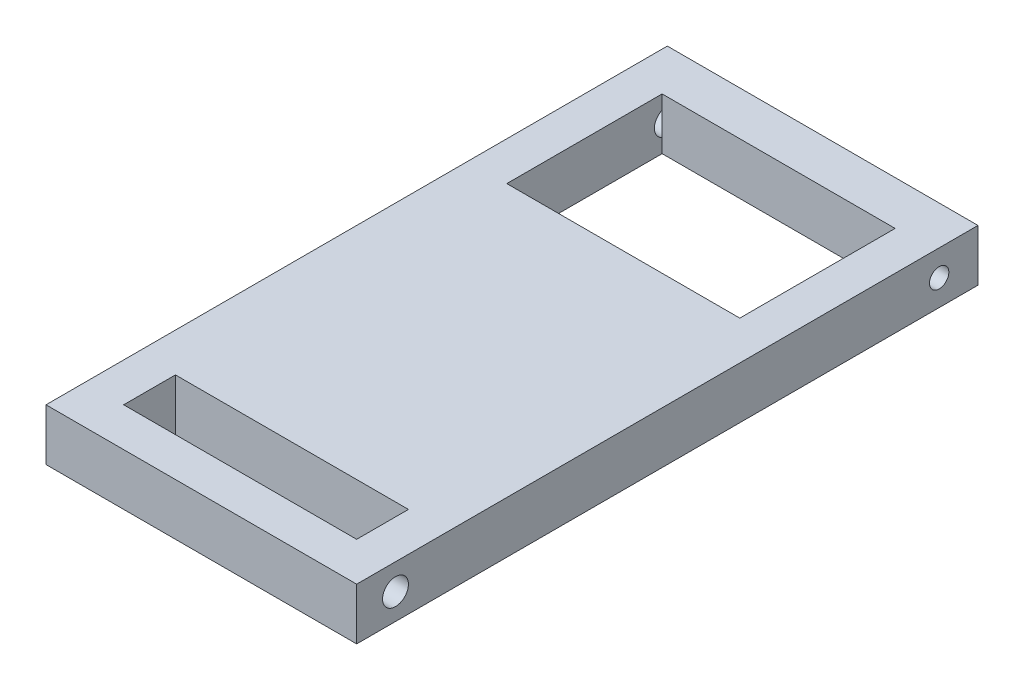
ISO-10303-21;
HEADER;
FILE_DESCRIPTION(('STEP AP214'),'2;1');
FILE_NAME('part.step','',(''),(''),'','','');
FILE_SCHEMA(('AUTOMOTIVE_DESIGN { 1 0 10303 214 1 1 1 1 }'));
ENDSEC;
DATA;
#1=APPLICATION_CONTEXT('core data for automotive mechanical design processes');
#2=APPLICATION_PROTOCOL_DEFINITION('international standard','automotive_design',2000,#1);
#3=PRODUCT_CONTEXT('',#1,'mechanical');
#4=PRODUCT('Part','Part','',(#3));
#5=PRODUCT_RELATED_PRODUCT_CATEGORY('part','',(#4));
#6=PRODUCT_DEFINITION_FORMATION('','',#4);
#7=PRODUCT_DEFINITION_CONTEXT('part definition',#1,'design');
#8=PRODUCT_DEFINITION('design','',#6,#7);
#9=PRODUCT_DEFINITION_SHAPE('','',#8);
#10=(LENGTH_UNIT() NAMED_UNIT(*) SI_UNIT(.MILLI.,.METRE.));
#11=(NAMED_UNIT(*) PLANE_ANGLE_UNIT() SI_UNIT($,.RADIAN.));
#12=(NAMED_UNIT(*) SI_UNIT($,.STERADIAN.) SOLID_ANGLE_UNIT());
#13=UNCERTAINTY_MEASURE_WITH_UNIT(LENGTH_MEASURE(1.E-05),#10,'distance_accuracy_value','');
#14=(GEOMETRIC_REPRESENTATION_CONTEXT(3) GLOBAL_UNCERTAINTY_ASSIGNED_CONTEXT((#13)) GLOBAL_UNIT_ASSIGNED_CONTEXT((#10,
#11,#12)) REPRESENTATION_CONTEXT('',''));
#15=CARTESIAN_POINT('',(0.,0.,0.));
#16=DIRECTION('',(0.,0.,1.));
#17=DIRECTION('',(1.,0.,0.));
#18=AXIS2_PLACEMENT_3D('',#15,#16,#17);
#19=CARTESIAN_POINT('',(133.35,12.7,-285.75));
#20=DIRECTION('',(1.,0.,0.));
#21=DIRECTION('',(0.,0.,-1.));
#22=AXIS2_PLACEMENT_3D('',#19,#20,#21);
#23=PLANE('',#22);
#24=CARTESIAN_POINT('',(133.35,12.7,-285.75));
#25=DIRECTION('',(1.,0.,0.));
#26=DIRECTION('',(0.,0.,-1.));
#27=AXIS2_PLACEMENT_3D('',#24,#25,#26);
#28=CIRCLE('',#27,4.74112595679173);
#29=CARTESIAN_POINT('',(133.35,8.70298310838306,-283.200072293908));
#30=VERTEX_POINT('',#29);
#31=CARTESIAN_POINT('',(133.35,16.6970168916169,-283.200072293908));
#32=VERTEX_POINT('',#31);
#33=EDGE_CURVE('E243',#30,#32,#28,.T.);
#34=ORIENTED_EDGE('',*,*,#33,.T.);
#35=DIRECTION('',(0.,-1.,0.));
#36=VECTOR('',#35,1.);
#37=CARTESIAN_POINT('',(133.35,27.94,-283.200072293908));
#38=LINE('',#37,#36);
#39=EDGE_CURVE('E154',#32,#30,#38,.T.);
#40=ORIENTED_EDGE('',*,*,#39,.T.);
#41=EDGE_LOOP('',(#34,#40));
#42=FACE_BOUND('',#41,.T.);
#43=ADVANCED_FACE('F33',(#42),#23,.T.);
#44=CARTESIAN_POINT('',(19.05,12.7,-19.05));
#45=DIRECTION('',(-1.,0.,0.));
#46=DIRECTION('',(0.,0.,1.));
#47=AXIS2_PLACEMENT_3D('',#44,#45,#46);
#48=PLANE('',#47);
#49=CARTESIAN_POINT('',(19.05,12.7,-19.05));
#50=DIRECTION('',(-1.,0.,0.));
#51=DIRECTION('',(0.,0.,1.));
#52=AXIS2_PLACEMENT_3D('',#49,#50,#51);
#53=CIRCLE('',#52,6.35);
#54=CARTESIAN_POINT('',(19.05,6.35,-19.05));
#55=VERTEX_POINT('',#54);
#56=CARTESIAN_POINT('',(19.05,19.05,-19.05));
#57=VERTEX_POINT('',#56);
#58=EDGE_CURVE('E238',#55,#57,#53,.T.);
#59=ORIENTED_EDGE('',*,*,#58,.T.);
#60=DIRECTION('',(0.,-1.,0.));
#61=VECTOR('',#60,1.);
#62=CARTESIAN_POINT('',(19.05,27.94,-19.05));
#63=LINE('',#62,#61);
#64=EDGE_CURVE('E195',#57,#55,#63,.T.);
#65=ORIENTED_EDGE('',*,*,#64,.T.);
#66=EDGE_LOOP('',(#59,#65));
#67=FACE_BOUND('',#66,.T.);
#68=ADVANCED_FACE('F306',(#67),#48,.T.);
#69=CARTESIAN_POINT('',(0.,25.4,0.));
#70=DIRECTION('',(0.,1.,0.));
#71=DIRECTION('',(0.,0.,1.));
#72=AXIS2_PLACEMENT_3D('',#69,#70,#71);
#73=PLANE('',#72);
#74=DIRECTION('',(-1.,0.,0.));
#75=VECTOR('',#74,1.);
#76=CARTESIAN_POINT('',(0.,25.4,-44.45));
#77=LINE('',#76,#75);
#78=CARTESIAN_POINT('',(133.35,25.4,-44.45));
#79=VERTEX_POINT('',#78);
#80=CARTESIAN_POINT('',(19.05,25.4,-44.45));
#81=VERTEX_POINT('',#80);
#82=EDGE_CURVE('E212',#79,#81,#77,.T.);
#83=ORIENTED_EDGE('',*,*,#82,.F.);
#84=DIRECTION('',(0.,0.,-1.));
#85=VECTOR('',#84,1.);
#86=CARTESIAN_POINT('',(133.35,25.4,0.));
#87=LINE('',#86,#85);
#88=CARTESIAN_POINT('',(133.35,25.4,-19.05));
#89=VERTEX_POINT('',#88);
#90=EDGE_CURVE('E205',#89,#79,#87,.T.);
#91=ORIENTED_EDGE('',*,*,#90,.F.);
#92=DIRECTION('',(1.,0.,0.));
#93=VECTOR('',#92,1.);
#94=CARTESIAN_POINT('',(0.,25.4,-19.05));
#95=LINE('',#94,#93);
#96=CARTESIAN_POINT('',(19.05,25.4,-19.05));
#97=VERTEX_POINT('',#96);
#98=EDGE_CURVE('E208',#97,#89,#95,.T.);
#99=ORIENTED_EDGE('',*,*,#98,.F.);
#100=DIRECTION('',(0.,0.,1.));
#101=VECTOR('',#100,1.);
#102=CARTESIAN_POINT('',(19.05,25.4,0.));
#103=LINE('',#102,#101);
#104=EDGE_CURVE('E210',#81,#97,#103,.T.);
#105=ORIENTED_EDGE('',*,*,#104,.F.);
#106=EDGE_LOOP('',(#83,#91,#99,#105));
#107=FACE_BOUND('',#106,.T.);
#108=DIRECTION('',(0.,0.,1.));
#109=VECTOR('',#108,1.);
#110=CARTESIAN_POINT('',(0.,25.4,-304.8));
#111=LINE('',#110,#109);
#112=CARTESIAN_POINT('',(0.,25.4,-304.8));
#113=VERTEX_POINT('',#112);
#114=CARTESIAN_POINT('',(0.,25.4,0.));
#115=VERTEX_POINT('',#114);
#116=EDGE_CURVE('E252',#113,#115,#111,.T.);
#117=ORIENTED_EDGE('',*,*,#116,.T.);
#118=DIRECTION('',(1.,0.,0.));
#119=VECTOR('',#118,1.);
#120=CARTESIAN_POINT('',(0.,25.4,0.));
#121=LINE('',#120,#119);
#122=CARTESIAN_POINT('',(152.4,25.4,0.));
#123=VERTEX_POINT('',#122);
#124=EDGE_CURVE('E255',#115,#123,#121,.T.);
#125=ORIENTED_EDGE('',*,*,#124,.T.);
#126=DIRECTION('',(0.,0.,-1.));
#127=VECTOR('',#126,1.);
#128=CARTESIAN_POINT('',(152.4,25.4,0.));
#129=LINE('',#128,#127);
#130=CARTESIAN_POINT('',(152.4,25.4,-304.8));
#131=VERTEX_POINT('',#130);
#132=EDGE_CURVE('E258',#123,#131,#129,.T.);
#133=ORIENTED_EDGE('',*,*,#132,.T.);
#134=DIRECTION('',(-1.,0.,0.));
#135=VECTOR('',#134,1.);
#136=CARTESIAN_POINT('',(152.4,25.4,-304.8));
#137=LINE('',#136,#135);
#138=EDGE_CURVE('E260',#131,#113,#137,.T.);
#139=ORIENTED_EDGE('',*,*,#138,.T.);
#140=EDGE_LOOP('',(#117,#125,#133,#139));
#141=FACE_BOUND('',#140,.T.);
#142=DIRECTION('',(1.,0.,0.));
#143=VECTOR('',#142,1.);
#144=CARTESIAN_POINT('',(0.,25.4,-283.200072293908));
#145=LINE('',#144,#143);
#146=CARTESIAN_POINT('',(19.05,25.4,-283.200072293908));
#147=VERTEX_POINT('',#146);
#148=CARTESIAN_POINT('',(133.35,25.4,-283.200072293908));
#149=VERTEX_POINT('',#148);
#150=EDGE_CURVE('E221',#147,#149,#145,.T.);
#151=ORIENTED_EDGE('',*,*,#150,.T.);
#152=DIRECTION('',(0.,0.,1.));
#153=VECTOR('',#152,1.);
#154=CARTESIAN_POINT('',(133.35,25.4,0.));
#155=LINE('',#154,#153);
#156=CARTESIAN_POINT('',(133.35,25.4,-207.000072293908));
#157=VERTEX_POINT('',#156);
#158=EDGE_CURVE('E224',#149,#157,#155,.T.);
#159=ORIENTED_EDGE('',*,*,#158,.T.);
#160=DIRECTION('',(-1.,0.,0.));
#161=VECTOR('',#160,1.);
#162=CARTESIAN_POINT('',(0.,25.4,-207.000072293908));
#163=LINE('',#162,#161);
#164=CARTESIAN_POINT('',(19.05,25.4,-207.000072293908));
#165=VERTEX_POINT('',#164);
#166=EDGE_CURVE('E214',#157,#165,#163,.T.);
#167=ORIENTED_EDGE('',*,*,#166,.T.);
#168=DIRECTION('',(0.,0.,-1.));
#169=VECTOR('',#168,1.);
#170=CARTESIAN_POINT('',(19.05,25.4,0.));
#171=LINE('',#170,#169);
#172=EDGE_CURVE('E217',#165,#147,#171,.T.);
#173=ORIENTED_EDGE('',*,*,#172,.T.);
#174=EDGE_LOOP('',(#151,#159,#167,#173));
#175=FACE_BOUND('',#174,.T.);
#176=ADVANCED_FACE('F294',(#107,#141,#175),#73,.T.);
#177=CARTESIAN_POINT('',(0.,0.,0.));
#178=DIRECTION('',(0.,1.,0.));
#179=DIRECTION('',(0.,0.,1.));
#180=AXIS2_PLACEMENT_3D('',#177,#178,#179);
#181=PLANE('',#180);
#182=DIRECTION('',(0.,0.,1.));
#183=VECTOR('',#182,1.);
#184=CARTESIAN_POINT('',(0.,0.,-304.8));
#185=LINE('',#184,#183);
#186=CARTESIAN_POINT('',(0.,0.,-304.8));
#187=VERTEX_POINT('',#186);
#188=CARTESIAN_POINT('',(0.,0.,0.));
#189=VERTEX_POINT('',#188);
#190=EDGE_CURVE('E249',#187,#189,#185,.T.);
#191=ORIENTED_EDGE('',*,*,#190,.F.);
#192=DIRECTION('',(-1.,0.,0.));
#193=VECTOR('',#192,1.);
#194=CARTESIAN_POINT('',(152.4,0.,-304.8));
#195=LINE('',#194,#193);
#196=CARTESIAN_POINT('',(152.4,0.,-304.8));
#197=VERTEX_POINT('',#196);
#198=EDGE_CURVE('E256',#197,#187,#195,.T.);
#199=ORIENTED_EDGE('',*,*,#198,.F.);
#200=DIRECTION('',(0.,0.,-1.));
#201=VECTOR('',#200,1.);
#202=CARTESIAN_POINT('',(152.4,0.,0.));
#203=LINE('',#202,#201);
#204=CARTESIAN_POINT('',(152.4,0.,0.));
#205=VERTEX_POINT('',#204);
#206=EDGE_CURVE('E267',#205,#197,#203,.T.);
#207=ORIENTED_EDGE('',*,*,#206,.F.);
#208=DIRECTION('',(1.,0.,0.));
#209=VECTOR('',#208,1.);
#210=CARTESIAN_POINT('',(0.,0.,0.));
#211=LINE('',#210,#209);
#212=EDGE_CURVE('E265',#189,#205,#211,.T.);
#213=ORIENTED_EDGE('',*,*,#212,.F.);
#214=EDGE_LOOP('',(#191,#199,#207,#213));
#215=FACE_BOUND('',#214,.T.);
#216=DIRECTION('',(0.,0.,1.));
#217=VECTOR('',#216,1.);
#218=CARTESIAN_POINT('',(133.35,0.,-44.45));
#219=LINE('',#218,#217);
#220=CARTESIAN_POINT('',(133.35,0.,-44.45));
#221=VERTEX_POINT('',#220);
#222=CARTESIAN_POINT('',(133.35,0.,-19.05));
#223=VERTEX_POINT('',#222);
#224=EDGE_CURVE('E174',#221,#223,#219,.T.);
#225=ORIENTED_EDGE('',*,*,#224,.F.);
#226=DIRECTION('',(1.,0.,0.));
#227=VECTOR('',#226,1.);
#228=CARTESIAN_POINT('',(19.05,0.,-44.45));
#229=LINE('',#228,#227);
#230=CARTESIAN_POINT('',(19.05,0.,-44.45));
#231=VERTEX_POINT('',#230);
#232=EDGE_CURVE('E172',#231,#221,#229,.T.);
#233=ORIENTED_EDGE('',*,*,#232,.F.);
#234=DIRECTION('',(0.,0.,-1.));
#235=VECTOR('',#234,1.);
#236=CARTESIAN_POINT('',(19.05,0.,-19.05));
#237=LINE('',#236,#235);
#238=CARTESIAN_POINT('',(19.05,0.,-19.05));
#239=VERTEX_POINT('',#238);
#240=EDGE_CURVE('E188',#239,#231,#237,.T.);
#241=ORIENTED_EDGE('',*,*,#240,.F.);
#242=DIRECTION('',(-1.,0.,0.));
#243=VECTOR('',#242,1.);
#244=CARTESIAN_POINT('',(133.35,0.,-19.05));
#245=LINE('',#244,#243);
#246=EDGE_CURVE('E200',#223,#239,#245,.T.);
#247=ORIENTED_EDGE('',*,*,#246,.F.);
#248=EDGE_LOOP('',(#225,#233,#241,#247));
#249=FACE_BOUND('',#248,.T.);
#250=DIRECTION('',(0.,0.,-1.));
#251=VECTOR('',#250,1.);
#252=CARTESIAN_POINT('',(133.35,0.,-207.000072293908));
#253=LINE('',#252,#251);
#254=CARTESIAN_POINT('',(133.35,0.,-207.000072293908));
#255=VERTEX_POINT('',#254);
#256=CARTESIAN_POINT('',(133.35,0.,-283.200072293908));
#257=VERTEX_POINT('',#256);
#258=EDGE_CURVE('E148',#255,#257,#253,.T.);
#259=ORIENTED_EDGE('',*,*,#258,.T.);
#260=DIRECTION('',(-1.,0.,0.));
#261=VECTOR('',#260,1.);
#262=CARTESIAN_POINT('',(133.35,0.,-283.200072293908));
#263=LINE('',#262,#261);
#264=CARTESIAN_POINT('',(19.05,0.,-283.200072293908));
#265=VERTEX_POINT('',#264);
#266=EDGE_CURVE('E159',#257,#265,#263,.T.);
#267=ORIENTED_EDGE('',*,*,#266,.T.);
#268=DIRECTION('',(0.,0.,1.));
#269=VECTOR('',#268,1.);
#270=CARTESIAN_POINT('',(19.05,0.,-283.200072293908));
#271=LINE('',#270,#269);
#272=CARTESIAN_POINT('',(19.05,0.,-207.000072293908));
#273=VERTEX_POINT('',#272);
#274=EDGE_CURVE('E166',#265,#273,#271,.T.);
#275=ORIENTED_EDGE('',*,*,#274,.T.);
#276=DIRECTION('',(1.,0.,0.));
#277=VECTOR('',#276,1.);
#278=CARTESIAN_POINT('',(19.05,0.,-207.000072293908));
#279=LINE('',#278,#277);
#280=EDGE_CURVE('E171',#273,#255,#279,.T.);
#281=ORIENTED_EDGE('',*,*,#280,.T.);
#282=EDGE_LOOP('',(#259,#267,#275,#281));
#283=FACE_BOUND('',#282,.T.);
#284=ADVANCED_FACE('F169',(#215,#249,#283),#181,.F.);
#285=CARTESIAN_POINT('',(0.,25.4,-304.8));
#286=DIRECTION('',(1.,0.,0.));
#287=DIRECTION('',(0.,0.,-1.));
#288=AXIS2_PLACEMENT_3D('',#285,#286,#287);
#289=PLANE('',#288);
#290=CARTESIAN_POINT('',(0.,12.7,-285.75));
#291=DIRECTION('',(-1.,0.,0.));
#292=DIRECTION('',(0.,0.,1.));
#293=AXIS2_PLACEMENT_3D('',#290,#291,#292);
#294=CIRCLE('',#293,6.35);
#295=CARTESIAN_POINT('',(0.,12.7,-279.4));
#296=VERTEX_POINT('',#295);
#297=EDGE_CURVE('E232',#296,#296,#294,.T.);
#298=ORIENTED_EDGE('',*,*,#297,.F.);
#299=EDGE_LOOP('',(#298));
#300=FACE_BOUND('',#299,.T.);
#301=CARTESIAN_POINT('',(0.,12.7,-19.05));
#302=DIRECTION('',(-1.,0.,0.));
#303=DIRECTION('',(0.,0.,1.));
#304=AXIS2_PLACEMENT_3D('',#301,#302,#303);
#305=CIRCLE('',#304,6.35);
#306=CARTESIAN_POINT('',(0.,12.7,-12.7));
#307=VERTEX_POINT('',#306);
#308=EDGE_CURVE('E227',#307,#307,#305,.T.);
#309=ORIENTED_EDGE('',*,*,#308,.F.);
#310=EDGE_LOOP('',(#309));
#311=FACE_BOUND('',#310,.T.);
#312=ORIENTED_EDGE('',*,*,#190,.T.);
#313=DIRECTION('',(0.,-1.,0.));
#314=VECTOR('',#313,1.);
#315=CARTESIAN_POINT('',(0.,25.4,0.));
#316=LINE('',#315,#314);
#317=EDGE_CURVE('E11',#115,#189,#316,.T.);
#318=ORIENTED_EDGE('',*,*,#317,.F.);
#319=ORIENTED_EDGE('',*,*,#116,.F.);
#320=DIRECTION('',(0.,-1.,0.));
#321=VECTOR('',#320,1.);
#322=CARTESIAN_POINT('',(0.,25.4,-304.8));
#323=LINE('',#322,#321);
#324=EDGE_CURVE('E262',#113,#187,#323,.T.);
#325=ORIENTED_EDGE('',*,*,#324,.T.);
#326=EDGE_LOOP('',(#312,#318,#319,#325));
#327=FACE_BOUND('',#326,.T.);
#328=ADVANCED_FACE('F35',(#300,#311,#327),#289,.F.);
#329=CARTESIAN_POINT('',(0.,25.4,0.));
#330=DIRECTION('',(0.,0.,-1.));
#331=DIRECTION('',(-1.,0.,0.));
#332=AXIS2_PLACEMENT_3D('',#329,#330,#331);
#333=PLANE('',#332);
#334=ORIENTED_EDGE('',*,*,#212,.T.);
#335=DIRECTION('',(0.,-1.,0.));
#336=VECTOR('',#335,1.);
#337=CARTESIAN_POINT('',(152.4,25.4,0.));
#338=LINE('',#337,#336);
#339=EDGE_CURVE('E41',#123,#205,#338,.T.);
#340=ORIENTED_EDGE('',*,*,#339,.F.);
#341=ORIENTED_EDGE('',*,*,#124,.F.);
#342=ORIENTED_EDGE('',*,*,#317,.T.);
#343=EDGE_LOOP('',(#334,#340,#341,#342));
#344=FACE_BOUND('',#343,.T.);
#345=ADVANCED_FACE('F296',(#344),#333,.F.);
#346=CARTESIAN_POINT('',(152.4,25.4,0.));
#347=DIRECTION('',(-1.,0.,0.));
#348=DIRECTION('',(0.,0.,1.));
#349=AXIS2_PLACEMENT_3D('',#346,#347,#348);
#350=PLANE('',#349);
#351=CARTESIAN_POINT('',(152.4,12.7,-285.75));
#352=DIRECTION('',(1.,0.,0.));
#353=DIRECTION('',(0.,0.,-1.));
#354=AXIS2_PLACEMENT_3D('',#351,#352,#353);
#355=CIRCLE('',#354,4.74112595679173);
#356=CARTESIAN_POINT('',(152.4,12.7,-290.491125956792));
#357=VERTEX_POINT('',#356);
#358=EDGE_CURVE('E231',#357,#357,#355,.T.);
#359=ORIENTED_EDGE('',*,*,#358,.F.);
#360=EDGE_LOOP('',(#359));
#361=FACE_BOUND('',#360,.T.);
#362=CARTESIAN_POINT('',(152.4,12.7,-19.05));
#363=DIRECTION('',(1.,0.,0.));
#364=DIRECTION('',(0.,0.,-1.));
#365=AXIS2_PLACEMENT_3D('',#362,#363,#364);
#366=CIRCLE('',#365,6.35);
#367=CARTESIAN_POINT('',(152.4,12.7,-25.4));
#368=VERTEX_POINT('',#367);
#369=EDGE_CURVE('E242',#368,#368,#366,.T.);
#370=ORIENTED_EDGE('',*,*,#369,.F.);
#371=EDGE_LOOP('',(#370));
#372=FACE_BOUND('',#371,.T.);
#373=ORIENTED_EDGE('',*,*,#206,.T.);
#374=DIRECTION('',(0.,-1.,0.));
#375=VECTOR('',#374,1.);
#376=CARTESIAN_POINT('',(152.4,25.4,-304.8));
#377=LINE('',#376,#375);
#378=EDGE_CURVE('E272',#131,#197,#377,.T.);
#379=ORIENTED_EDGE('',*,*,#378,.F.);
#380=ORIENTED_EDGE('',*,*,#132,.F.);
#381=ORIENTED_EDGE('',*,*,#339,.T.);
#382=EDGE_LOOP('',(#373,#379,#380,#381));
#383=FACE_BOUND('',#382,.T.);
#384=ADVANCED_FACE('F279',(#361,#372,#383),#350,.F.);
#385=CARTESIAN_POINT('',(152.4,25.4,-304.8));
#386=DIRECTION('',(0.,0.,1.));
#387=DIRECTION('',(1.,0.,0.));
#388=AXIS2_PLACEMENT_3D('',#385,#386,#387);
#389=PLANE('',#388);
#390=ORIENTED_EDGE('',*,*,#198,.T.);
#391=ORIENTED_EDGE('',*,*,#324,.F.);
#392=ORIENTED_EDGE('',*,*,#138,.F.);
#393=ORIENTED_EDGE('',*,*,#378,.T.);
#394=EDGE_LOOP('',(#390,#391,#392,#393));
#395=FACE_BOUND('',#394,.T.);
#396=ADVANCED_FACE('F288',(#395),#389,.F.);
#397=CARTESIAN_POINT('',(133.35,12.7,-19.05));
#398=DIRECTION('',(1.,0.,0.));
#399=DIRECTION('',(0.,0.,-1.));
#400=AXIS2_PLACEMENT_3D('',#397,#398,#399);
#401=CYLINDRICAL_SURFACE('',#400,6.35);
#402=CARTESIAN_POINT('',(133.35,12.7,-19.05));
#403=DIRECTION('',(1.,0.,0.));
#404=DIRECTION('',(0.,0.,-1.));
#405=AXIS2_PLACEMENT_3D('',#402,#403,#404);
#406=CIRCLE('',#405,6.35);
#407=CARTESIAN_POINT('',(133.35,19.05,-19.05));
#408=VERTEX_POINT('',#407);
#409=CARTESIAN_POINT('',(133.35,6.35,-19.05));
#410=VERTEX_POINT('',#409);
#411=EDGE_CURVE('E246',#408,#410,#406,.T.);
#412=ORIENTED_EDGE('',*,*,#411,.F.);
#413=EDGE_CURVE('E207',#410,#408,#406,.T.);
#414=ORIENTED_EDGE('',*,*,#413,.F.);
#415=EDGE_LOOP('',(#412,#414));
#416=FACE_BOUND('',#415,.T.);
#417=ORIENTED_EDGE('',*,*,#369,.T.);
#418=EDGE_LOOP('',(#417));
#419=FACE_BOUND('',#418,.T.);
#420=ADVANCED_FACE('F325',(#416,#419),#401,.F.);
#421=CARTESIAN_POINT('',(133.35,12.7,-19.05));
#422=DIRECTION('',(1.,0.,0.));
#423=DIRECTION('',(0.,0.,-1.));
#424=AXIS2_PLACEMENT_3D('',#421,#422,#423);
#425=PLANE('',#424);
#426=DIRECTION('',(0.,-1.,0.));
#427=VECTOR('',#426,1.);
#428=CARTESIAN_POINT('',(133.35,27.94,-19.05));
#429=LINE('',#428,#427);
#430=EDGE_CURVE('E191',#408,#410,#429,.T.);
#431=ORIENTED_EDGE('',*,*,#430,.F.);
#432=ORIENTED_EDGE('',*,*,#411,.T.);
#433=EDGE_LOOP('',(#431,#432));
#434=FACE_BOUND('',#433,.T.);
#435=ADVANCED_FACE('F321',(#434),#425,.T.);
#436=CARTESIAN_POINT('',(133.35,12.7,-285.75));
#437=DIRECTION('',(1.,0.,0.));
#438=DIRECTION('',(0.,0.,-1.));
#439=AXIS2_PLACEMENT_3D('',#436,#437,#438);
#440=CYLINDRICAL_SURFACE('',#439,4.74112595679173);
#441=EDGE_CURVE('E152',#32,#30,#28,.T.);
#442=ORIENTED_EDGE('',*,*,#441,.F.);
#443=ORIENTED_EDGE('',*,*,#33,.F.);
#444=EDGE_LOOP('',(#442,#443));
#445=FACE_BOUND('',#444,.T.);
#446=ORIENTED_EDGE('',*,*,#358,.T.);
#447=EDGE_LOOP('',(#446));
#448=FACE_BOUND('',#447,.T.);
#449=ADVANCED_FACE('F318',(#445,#448),#440,.F.);
#450=CARTESIAN_POINT('',(19.05,12.7,-19.05));
#451=DIRECTION('',(-1.,0.,0.));
#452=DIRECTION('',(0.,0.,1.));
#453=AXIS2_PLACEMENT_3D('',#450,#451,#452);
#454=CYLINDRICAL_SURFACE('',#453,6.35);
#455=EDGE_CURVE('E235',#57,#55,#53,.T.);
#456=ORIENTED_EDGE('',*,*,#455,.F.);
#457=ORIENTED_EDGE('',*,*,#58,.F.);
#458=EDGE_LOOP('',(#456,#457));
#459=FACE_BOUND('',#458,.T.);
#460=ORIENTED_EDGE('',*,*,#308,.T.);
#461=EDGE_LOOP('',(#460));
#462=FACE_BOUND('',#461,.T.);
#463=ADVANCED_FACE('F317',(#459,#462),#454,.F.);
#464=CARTESIAN_POINT('',(19.05,12.7,-285.75));
#465=DIRECTION('',(-1.,0.,0.));
#466=DIRECTION('',(0.,0.,1.));
#467=AXIS2_PLACEMENT_3D('',#464,#465,#466);
#468=CYLINDRICAL_SURFACE('',#467,6.35);
#469=CARTESIAN_POINT('',(19.05,12.7,-285.75));
#470=DIRECTION('',(-1.,0.,0.));
#471=DIRECTION('',(0.,0.,1.));
#472=AXIS2_PLACEMENT_3D('',#469,#470,#471);
#473=CIRCLE('',#472,6.35);
#474=CARTESIAN_POINT('',(19.05,18.5155282385787,-283.200072293908));
#475=VERTEX_POINT('',#474);
#476=CARTESIAN_POINT('',(19.05,6.88447176142126,-283.200072293908));
#477=VERTEX_POINT('',#476);
#478=EDGE_CURVE('E228',#475,#477,#473,.T.);
#479=ORIENTED_EDGE('',*,*,#478,.F.);
#480=EDGE_CURVE('E220',#477,#475,#473,.T.);
#481=ORIENTED_EDGE('',*,*,#480,.F.);
#482=EDGE_LOOP('',(#479,#481));
#483=FACE_BOUND('',#482,.T.);
#484=ORIENTED_EDGE('',*,*,#297,.T.);
#485=EDGE_LOOP('',(#484));
#486=FACE_BOUND('',#485,.T.);
#487=ADVANCED_FACE('F359',(#483,#486),#468,.F.);
#488=CARTESIAN_POINT('',(19.05,12.7,-285.75));
#489=DIRECTION('',(-1.,0.,0.));
#490=DIRECTION('',(0.,0.,1.));
#491=AXIS2_PLACEMENT_3D('',#488,#489,#490);
#492=PLANE('',#491);
#493=DIRECTION('',(0.,-1.,0.));
#494=VECTOR('',#493,1.);
#495=CARTESIAN_POINT('',(19.05,27.94,-283.200072293908));
#496=LINE('',#495,#494);
#497=EDGE_CURVE('E183',#475,#477,#496,.T.);
#498=ORIENTED_EDGE('',*,*,#497,.F.);
#499=ORIENTED_EDGE('',*,*,#478,.T.);
#500=EDGE_LOOP('',(#498,#499));
#501=FACE_BOUND('',#500,.T.);
#502=ADVANCED_FACE('F366',(#501),#492,.T.);
#503=CARTESIAN_POINT('',(19.05,27.94,-44.45));
#504=DIRECTION('',(0.,0.,-1.));
#505=DIRECTION('',(-1.,0.,0.));
#506=AXIS2_PLACEMENT_3D('',#503,#504,#505);
#507=PLANE('',#506);
#508=ORIENTED_EDGE('',*,*,#82,.T.);
#509=DIRECTION('',(0.,-1.,0.));
#510=VECTOR('',#509,1.);
#511=CARTESIAN_POINT('',(19.05,27.94,-44.45));
#512=LINE('',#511,#510);
#513=EDGE_CURVE('E196',#81,#231,#512,.T.);
#514=ORIENTED_EDGE('',*,*,#513,.T.);
#515=ORIENTED_EDGE('',*,*,#232,.T.);
#516=DIRECTION('',(0.,-1.,0.));
#517=VECTOR('',#516,1.);
#518=CARTESIAN_POINT('',(133.35,27.94,-44.45));
#519=LINE('',#518,#517);
#520=EDGE_CURVE('E185',#79,#221,#519,.T.);
#521=ORIENTED_EDGE('',*,*,#520,.F.);
#522=EDGE_LOOP('',(#508,#514,#515,#521));
#523=FACE_BOUND('',#522,.T.);
#524=ADVANCED_FACE('F374',(#523),#507,.F.);
#525=CARTESIAN_POINT('',(19.05,27.94,-19.05));
#526=DIRECTION('',(-1.,0.,0.));
#527=DIRECTION('',(0.,0.,1.));
#528=AXIS2_PLACEMENT_3D('',#525,#526,#527);
#529=PLANE('',#528);
#530=ORIENTED_EDGE('',*,*,#455,.T.);
#531=EDGE_CURVE('E193',#55,#239,#63,.T.);
#532=ORIENTED_EDGE('',*,*,#531,.T.);
#533=ORIENTED_EDGE('',*,*,#240,.T.);
#534=ORIENTED_EDGE('',*,*,#513,.F.);
#535=ORIENTED_EDGE('',*,*,#104,.T.);
#536=EDGE_CURVE('E192',#97,#57,#63,.T.);
#537=ORIENTED_EDGE('',*,*,#536,.T.);
#538=EDGE_LOOP('',(#530,#532,#533,#534,#535,#537));
#539=FACE_BOUND('',#538,.T.);
#540=ADVANCED_FACE('F382',(#539),#529,.F.);
#541=CARTESIAN_POINT('',(133.35,27.94,-19.05));
#542=DIRECTION('',(0.,0.,1.));
#543=DIRECTION('',(1.,0.,0.));
#544=AXIS2_PLACEMENT_3D('',#541,#542,#543);
#545=PLANE('',#544);
#546=ORIENTED_EDGE('',*,*,#98,.T.);
#547=EDGE_CURVE('E48',#89,#408,#429,.T.);
#548=ORIENTED_EDGE('',*,*,#547,.T.);
#549=ORIENTED_EDGE('',*,*,#430,.T.);
#550=EDGE_CURVE('E189',#410,#223,#429,.T.);
#551=ORIENTED_EDGE('',*,*,#550,.T.);
#552=ORIENTED_EDGE('',*,*,#246,.T.);
#553=ORIENTED_EDGE('',*,*,#531,.F.);
#554=ORIENTED_EDGE('',*,*,#64,.F.);
#555=ORIENTED_EDGE('',*,*,#536,.F.);
#556=EDGE_LOOP('',(#546,#548,#549,#551,#552,#553,#554,#555));
#557=FACE_BOUND('',#556,.T.);
#558=ADVANCED_FACE('F390',(#557),#545,.F.);
#559=CARTESIAN_POINT('',(133.35,27.94,-44.45));
#560=DIRECTION('',(1.,0.,0.));
#561=DIRECTION('',(0.,0.,-1.));
#562=AXIS2_PLACEMENT_3D('',#559,#560,#561);
#563=PLANE('',#562);
#564=ORIENTED_EDGE('',*,*,#413,.T.);
#565=ORIENTED_EDGE('',*,*,#547,.F.);
#566=ORIENTED_EDGE('',*,*,#90,.T.);
#567=ORIENTED_EDGE('',*,*,#520,.T.);
#568=ORIENTED_EDGE('',*,*,#224,.T.);
#569=ORIENTED_EDGE('',*,*,#550,.F.);
#570=EDGE_LOOP('',(#564,#565,#566,#567,#568,#569));
#571=FACE_BOUND('',#570,.T.);
#572=ADVANCED_FACE('F398',(#571),#563,.F.);
#573=CARTESIAN_POINT('',(133.35,27.94,-207.000072293908));
#574=DIRECTION('',(-1.,0.,0.));
#575=DIRECTION('',(0.,0.,1.));
#576=AXIS2_PLACEMENT_3D('',#573,#574,#575);
#577=PLANE('',#576);
#578=ORIENTED_EDGE('',*,*,#441,.T.);
#579=EDGE_CURVE('E56',#30,#257,#38,.T.);
#580=ORIENTED_EDGE('',*,*,#579,.T.);
#581=ORIENTED_EDGE('',*,*,#258,.F.);
#582=DIRECTION('',(0.,-1.,0.));
#583=VECTOR('',#582,1.);
#584=CARTESIAN_POINT('',(133.35,27.94,-207.000072293908));
#585=LINE('',#584,#583);
#586=EDGE_CURVE('E179',#157,#255,#585,.T.);
#587=ORIENTED_EDGE('',*,*,#586,.F.);
#588=ORIENTED_EDGE('',*,*,#158,.F.);
#589=EDGE_CURVE('E157',#149,#32,#38,.T.);
#590=ORIENTED_EDGE('',*,*,#589,.T.);
#591=EDGE_LOOP('',(#578,#580,#581,#587,#588,#590));
#592=FACE_BOUND('',#591,.T.);
#593=ADVANCED_FACE('F145',(#592),#577,.T.);
#594=CARTESIAN_POINT('',(19.05,27.94,-283.200072293908));
#595=DIRECTION('',(1.,0.,0.));
#596=DIRECTION('',(0.,0.,-1.));
#597=AXIS2_PLACEMENT_3D('',#594,#595,#596);
#598=PLANE('',#597);
#599=ORIENTED_EDGE('',*,*,#480,.T.);
#600=EDGE_CURVE('E155',#147,#475,#496,.T.);
#601=ORIENTED_EDGE('',*,*,#600,.F.);
#602=ORIENTED_EDGE('',*,*,#172,.F.);
#603=DIRECTION('',(0.,-1.,0.));
#604=VECTOR('',#603,1.);
#605=CARTESIAN_POINT('',(19.05,27.94,-207.000072293908));
#606=LINE('',#605,#604);
#607=EDGE_CURVE('E181',#165,#273,#606,.T.);
#608=ORIENTED_EDGE('',*,*,#607,.T.);
#609=ORIENTED_EDGE('',*,*,#274,.F.);
#610=EDGE_CURVE('E162',#477,#265,#496,.T.);
#611=ORIENTED_EDGE('',*,*,#610,.F.);
#612=EDGE_LOOP('',(#599,#601,#602,#608,#609,#611));
#613=FACE_BOUND('',#612,.T.);
#614=ADVANCED_FACE('F412',(#613),#598,.T.);
#615=CARTESIAN_POINT('',(133.35,27.94,-283.200072293908));
#616=DIRECTION('',(0.,0.,1.));
#617=DIRECTION('',(1.,0.,0.));
#618=AXIS2_PLACEMENT_3D('',#615,#616,#617);
#619=PLANE('',#618);
#620=ORIENTED_EDGE('',*,*,#600,.T.);
#621=ORIENTED_EDGE('',*,*,#497,.T.);
#622=ORIENTED_EDGE('',*,*,#610,.T.);
#623=ORIENTED_EDGE('',*,*,#266,.F.);
#624=ORIENTED_EDGE('',*,*,#579,.F.);
#625=ORIENTED_EDGE('',*,*,#39,.F.);
#626=ORIENTED_EDGE('',*,*,#589,.F.);
#627=ORIENTED_EDGE('',*,*,#150,.F.);
#628=EDGE_LOOP('',(#620,#621,#622,#623,#624,#625,#626,#627));
#629=FACE_BOUND('',#628,.T.);
#630=ADVANCED_FACE('F160',(#629),#619,.T.);
#631=CARTESIAN_POINT('',(19.05,27.94,-207.000072293908));
#632=DIRECTION('',(0.,0.,-1.));
#633=DIRECTION('',(-1.,0.,0.));
#634=AXIS2_PLACEMENT_3D('',#631,#632,#633);
#635=PLANE('',#634);
#636=ORIENTED_EDGE('',*,*,#586,.T.);
#637=ORIENTED_EDGE('',*,*,#280,.F.);
#638=ORIENTED_EDGE('',*,*,#607,.F.);
#639=ORIENTED_EDGE('',*,*,#166,.F.);
#640=EDGE_LOOP('',(#636,#637,#638,#639));
#641=FACE_BOUND('',#640,.T.);
#642=ADVANCED_FACE('F426',(#641),#635,.T.);
#643=CLOSED_SHELL('',(#43,#68,#176,#284,#328,#345,#384,#396,#420,#435,#449,#463,#487,#502,#524,
#540,#558,#572,#593,#614,#630,#642));
#644=MANIFOLD_SOLID_BREP('B2',#643);
#645=ADVANCED_BREP_SHAPE_REPRESENTATION('',(#18,#644),#14);
#646=SHAPE_DEFINITION_REPRESENTATION(#9,#645);
ENDSEC;
END-ISO-10303-21;
